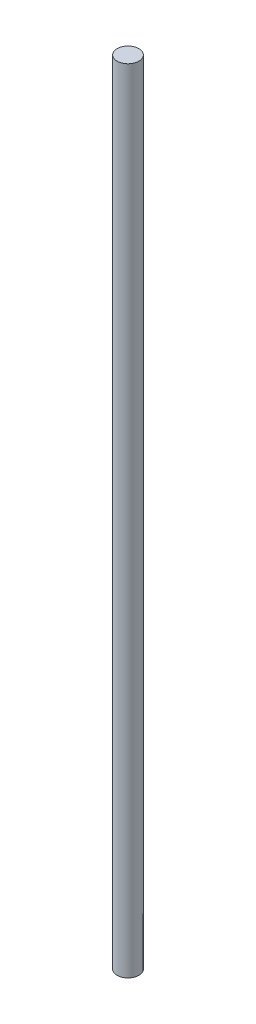
ISO-10303-21;
HEADER;
FILE_DESCRIPTION(('STEP AP214'),'2;1');
FILE_NAME('part.step','',(''),(''),'','','');
FILE_SCHEMA(('AUTOMOTIVE_DESIGN { 1 0 10303 214 1 1 1 1 }'));
ENDSEC;
DATA;
#1=APPLICATION_CONTEXT('core data for automotive mechanical design processes');
#2=APPLICATION_PROTOCOL_DEFINITION('international standard','automotive_design',2000,#1);
#3=PRODUCT_CONTEXT('',#1,'mechanical');
#4=PRODUCT('Part','Part','',(#3));
#5=PRODUCT_RELATED_PRODUCT_CATEGORY('part','',(#4));
#6=PRODUCT_DEFINITION_FORMATION('','',#4);
#7=PRODUCT_DEFINITION_CONTEXT('part definition',#1,'design');
#8=PRODUCT_DEFINITION('design','',#6,#7);
#9=PRODUCT_DEFINITION_SHAPE('','',#8);
#10=(LENGTH_UNIT() NAMED_UNIT(*) SI_UNIT(.MILLI.,.METRE.));
#11=(NAMED_UNIT(*) PLANE_ANGLE_UNIT() SI_UNIT($,.RADIAN.));
#12=(NAMED_UNIT(*) SI_UNIT($,.STERADIAN.) SOLID_ANGLE_UNIT());
#13=UNCERTAINTY_MEASURE_WITH_UNIT(LENGTH_MEASURE(1.E-05),#10,'distance_accuracy_value','');
#14=(GEOMETRIC_REPRESENTATION_CONTEXT(3) GLOBAL_UNCERTAINTY_ASSIGNED_CONTEXT((#13)) GLOBAL_UNIT_ASSIGNED_CONTEXT((#10,
#11,#12)) REPRESENTATION_CONTEXT('',''));
#15=CARTESIAN_POINT('',(0.,0.,0.));
#16=DIRECTION('',(0.,0.,1.));
#17=DIRECTION('',(1.,0.,0.));
#18=AXIS2_PLACEMENT_3D('',#15,#16,#17);
#19=CARTESIAN_POINT('',(0.,200.,0.));
#20=DIRECTION('',(0.,-1.,0.));
#21=DIRECTION('',(0.,0.,-1.));
#22=AXIS2_PLACEMENT_3D('',#19,#20,#21);
#23=CYLINDRICAL_SURFACE('',#22,2.75);
#24=CARTESIAN_POINT('',(0.,200.,0.));
#25=DIRECTION('',(0.,1.,0.));
#26=DIRECTION('',(0.,0.,1.));
#27=AXIS2_PLACEMENT_3D('',#24,#25,#26);
#28=CIRCLE('',#27,2.75);
#29=CARTESIAN_POINT('',(0.,200.,2.75));
#30=VERTEX_POINT('',#29);
#31=EDGE_CURVE('E10',#30,#30,#28,.T.);
#32=ORIENTED_EDGE('',*,*,#31,.F.);
#33=EDGE_LOOP('',(#32));
#34=FACE_BOUND('',#33,.T.);
#35=CARTESIAN_POINT('',(0.,0.,0.));
#36=DIRECTION('',(0.,1.,0.));
#37=DIRECTION('',(0.,0.,1.));
#38=AXIS2_PLACEMENT_3D('',#35,#36,#37);
#39=CIRCLE('',#38,2.75);
#40=CARTESIAN_POINT('',(0.,0.,2.75));
#41=VERTEX_POINT('',#40);
#42=EDGE_CURVE('E41',#41,#41,#39,.T.);
#43=ORIENTED_EDGE('',*,*,#42,.T.);
#44=EDGE_LOOP('',(#43));
#45=FACE_BOUND('',#44,.T.);
#46=ADVANCED_FACE('F36',(#34,#45),#23,.T.);
#47=CARTESIAN_POINT('',(0.,200.,0.));
#48=DIRECTION('',(0.,1.,0.));
#49=DIRECTION('',(0.,0.,1.));
#50=AXIS2_PLACEMENT_3D('',#47,#48,#49);
#51=PLANE('',#50);
#52=ORIENTED_EDGE('',*,*,#31,.T.);
#53=EDGE_LOOP('',(#52));
#54=FACE_BOUND('',#53,.T.);
#55=ADVANCED_FACE('F52',(#54),#51,.T.);
#56=CARTESIAN_POINT('',(0.,0.,0.));
#57=DIRECTION('',(0.,1.,0.));
#58=DIRECTION('',(0.,0.,1.));
#59=AXIS2_PLACEMENT_3D('',#56,#57,#58);
#60=PLANE('',#59);
#61=ORIENTED_EDGE('',*,*,#42,.F.);
#62=EDGE_LOOP('',(#61));
#63=FACE_BOUND('',#62,.T.);
#64=ADVANCED_FACE('F51',(#63),#60,.F.);
#65=CLOSED_SHELL('',(#46,#55,#64));
#66=MANIFOLD_SOLID_BREP('B2',#65);
#67=ADVANCED_BREP_SHAPE_REPRESENTATION('',(#18,#66),#14);
#68=SHAPE_DEFINITION_REPRESENTATION(#9,#67);
ENDSEC;
END-ISO-10303-21;
